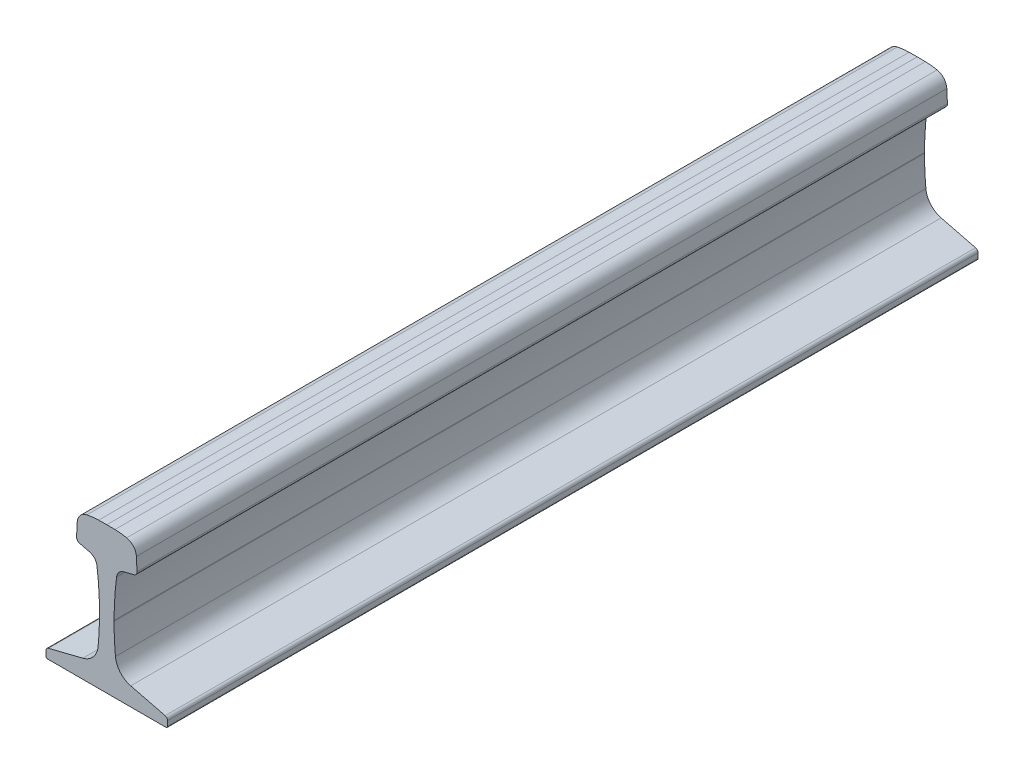
ISO-10303-21;
HEADER;
FILE_DESCRIPTION(('STEP AP214'),'2;1');
FILE_NAME('part.step','',(''),(''),'','','');
FILE_SCHEMA(('AUTOMOTIVE_DESIGN { 1 0 10303 214 1 1 1 1 }'));
ENDSEC;
DATA;
#1=APPLICATION_CONTEXT('core data for automotive mechanical design processes');
#2=APPLICATION_PROTOCOL_DEFINITION('international standard','automotive_design',2000,#1);
#3=PRODUCT_CONTEXT('',#1,'mechanical');
#4=PRODUCT('Part','Part','',(#3));
#5=PRODUCT_RELATED_PRODUCT_CATEGORY('part','',(#4));
#6=PRODUCT_DEFINITION_FORMATION('','',#4);
#7=PRODUCT_DEFINITION_CONTEXT('part definition',#1,'design');
#8=PRODUCT_DEFINITION('design','',#6,#7);
#9=PRODUCT_DEFINITION_SHAPE('','',#8);
#10=(LENGTH_UNIT() NAMED_UNIT(*) SI_UNIT(.MILLI.,.METRE.));
#11=(NAMED_UNIT(*) PLANE_ANGLE_UNIT() SI_UNIT($,.RADIAN.));
#12=(NAMED_UNIT(*) SI_UNIT($,.STERADIAN.) SOLID_ANGLE_UNIT());
#13=UNCERTAINTY_MEASURE_WITH_UNIT(LENGTH_MEASURE(1.E-05),#10,'distance_accuracy_value','');
#14=(GEOMETRIC_REPRESENTATION_CONTEXT(3) GLOBAL_UNCERTAINTY_ASSIGNED_CONTEXT((#13)) GLOBAL_UNIT_ASSIGNED_CONTEXT((#10,
#11,#12)) REPRESENTATION_CONTEXT('',''));
#15=CARTESIAN_POINT('',(0.,0.,0.));
#16=DIRECTION('',(0.,0.,1.));
#17=DIRECTION('',(1.,0.,0.));
#18=AXIS2_PLACEMENT_3D('',#15,#16,#17);
#19=CARTESIAN_POINT('',(9.00000002470919,82.3,-1000.));
#20=DIRECTION('',(1.,0.,0.));
#21=DIRECTION('',(0.,0.,-1.));
#22=AXIS2_PLACEMENT_3D('',#19,#20,#21);
#23=PLANE('',#22);
#24=DIRECTION('',(0.,1.,0.));
#25=VECTOR('',#24,1.);
#26=CARTESIAN_POINT('',(9.00000002470919,82.3,-1000.));
#27=LINE('',#26,#25);
#28=CARTESIAN_POINT('',(9.00000002470805,81.2999999999996,-1000.));
#29=VERTEX_POINT('',#28);
#30=CARTESIAN_POINT('',(9.00000002470921,82.3000000000001,-1000.));
#31=VERTEX_POINT('',#30);
#32=EDGE_CURVE('E332',#29,#31,#27,.T.);
#33=ORIENTED_EDGE('',*,*,#32,.T.);
#34=DIRECTION('',(0.,0.,1.));
#35=VECTOR('',#34,1.);
#36=CARTESIAN_POINT('',(9.00000002470924,82.3000000000001,-1000.));
#37=LINE('',#36,#35);
#38=CARTESIAN_POINT('',(9.00000002470921,82.3000000000001,0.));
#39=VERTEX_POINT('',#38);
#40=EDGE_CURVE('E320',#39,#31,#37,.F.);
#41=ORIENTED_EDGE('',*,*,#40,.F.);
#42=DIRECTION('',(0.,1.,0.));
#43=VECTOR('',#42,1.);
#44=CARTESIAN_POINT('',(9.00000002470919,82.3,0.));
#45=LINE('',#44,#43);
#46=CARTESIAN_POINT('',(9.00000002470805,81.2999999999996,0.));
#47=VERTEX_POINT('',#46);
#48=EDGE_CURVE('E334',#39,#47,#45,.F.);
#49=ORIENTED_EDGE('',*,*,#48,.T.);
#50=DIRECTION('',(0.,0.,1.));
#51=VECTOR('',#50,1.);
#52=CARTESIAN_POINT('',(9.00000002470691,81.2999999999997,-1000.));
#53=LINE('',#52,#51);
#54=EDGE_CURVE('E323',#29,#47,#53,.T.);
#55=ORIENTED_EDGE('',*,*,#54,.F.);
#56=EDGE_LOOP('',(#33,#41,#49,#55));
#57=FACE_BOUND('',#56,.T.);
#58=ADVANCED_FACE('F15',(#57),#23,.T.);
#59=CARTESIAN_POINT('',(-8.99999997529081,82.3,-1000.));
#60=DIRECTION('',(-1.,0.,0.));
#61=DIRECTION('',(0.,0.,1.));
#62=AXIS2_PLACEMENT_3D('',#59,#60,#61);
#63=PLANE('',#62);
#64=DIRECTION('',(0.,1.,0.));
#65=VECTOR('',#64,1.);
#66=CARTESIAN_POINT('',(-8.99999997529081,82.3,-1000.));
#67=LINE('',#66,#65);
#68=CARTESIAN_POINT('',(-8.9999999752908,82.3,-1000.));
#69=VERTEX_POINT('',#68);
#70=CARTESIAN_POINT('',(-8.99999997528966,81.2999999999995,-1000.));
#71=VERTEX_POINT('',#70);
#72=EDGE_CURVE('E229',#69,#71,#67,.F.);
#73=ORIENTED_EDGE('',*,*,#72,.T.);
#74=DIRECTION('',(0.,0.,1.));
#75=VECTOR('',#74,1.);
#76=CARTESIAN_POINT('',(-8.9999999752885,81.2999999999995,-1000.));
#77=LINE('',#76,#75);
#78=CARTESIAN_POINT('',(-8.99999997528966,81.2999999999995,0.));
#79=VERTEX_POINT('',#78);
#80=EDGE_CURVE('E269',#79,#71,#77,.F.);
#81=ORIENTED_EDGE('',*,*,#80,.F.);
#82=DIRECTION('',(0.,1.,0.));
#83=VECTOR('',#82,1.);
#84=CARTESIAN_POINT('',(-8.99999997529081,82.3,0.));
#85=LINE('',#84,#83);
#86=CARTESIAN_POINT('',(-8.9999999752908,82.3,0.));
#87=VERTEX_POINT('',#86);
#88=EDGE_CURVE('E330',#79,#87,#85,.T.);
#89=ORIENTED_EDGE('',*,*,#88,.T.);
#90=DIRECTION('',(0.,0.,1.));
#91=VECTOR('',#90,1.);
#92=CARTESIAN_POINT('',(-8.99999997529077,82.3,-1000.));
#93=LINE('',#92,#91);
#94=EDGE_CURVE('E272',#69,#87,#93,.T.);
#95=ORIENTED_EDGE('',*,*,#94,.F.);
#96=EDGE_LOOP('',(#73,#81,#89,#95));
#97=FACE_BOUND('',#96,.T.);
#98=ADVANCED_FACE('F561',(#97),#63,.T.);
#99=CARTESIAN_POINT('',(71.0000000494184,8.12689437438246,-1000.));
#100=DIRECTION('',(0.,0.,1.));
#101=DIRECTION('',(1.,0.,0.));
#102=AXIS2_PLACEMENT_3D('',#99,#100,#101);
#103=CYLINDRICAL_SURFACE('',#102,4.);
#104=CARTESIAN_POINT('',(71.0000000494184,8.12689437438246,-1000.));
#105=DIRECTION('',(0.,0.,1.));
#106=DIRECTION('',(1.,0.,0.));
#107=AXIS2_PLACEMENT_3D('',#104,#105,#106);
#108=CIRCLE('',#107,4.);
#109=CARTESIAN_POINT('',(75.0000000494184,8.12689437438234,-1000.));
#110=VERTEX_POINT('',#109);
#111=CARTESIAN_POINT('',(71.970142549564,12.0074643749637,-1000.));
#112=VERTEX_POINT('',#111);
#113=EDGE_CURVE('E225',#110,#112,#108,.T.);
#114=ORIENTED_EDGE('',*,*,#113,.T.);
#115=DIRECTION('',(0.,0.,1.));
#116=VECTOR('',#115,1.);
#117=CARTESIAN_POINT('',(71.9701425495642,12.0074643749637,-1000.));
#118=LINE('',#117,#116);
#119=CARTESIAN_POINT('',(71.970142549564,12.0074643749637,0.));
#120=VERTEX_POINT('',#119);
#121=EDGE_CURVE('E219',#120,#112,#118,.F.);
#122=ORIENTED_EDGE('',*,*,#121,.F.);
#123=CARTESIAN_POINT('',(71.0000000494184,8.12689437438246,0.));
#124=DIRECTION('',(0.,0.,1.));
#125=DIRECTION('',(1.,0.,0.));
#126=AXIS2_PLACEMENT_3D('',#123,#124,#125);
#127=CIRCLE('',#126,4.);
#128=CARTESIAN_POINT('',(75.0000000494184,8.12689437438234,0.));
#129=VERTEX_POINT('',#128);
#130=EDGE_CURVE('E18',#129,#120,#127,.T.);
#131=ORIENTED_EDGE('',*,*,#130,.F.);
#132=DIRECTION('',(0.,0.,-1.));
#133=VECTOR('',#132,1.);
#134=CARTESIAN_POINT('',(75.0000000494184,8.12689437438223,-1000.));
#135=LINE('',#134,#133);
#136=EDGE_CURVE('E214',#110,#129,#135,.F.);
#137=ORIENTED_EDGE('',*,*,#136,.F.);
#138=EDGE_LOOP('',(#114,#122,#131,#137));
#139=FACE_BOUND('',#138,.T.);
#140=ADVANCED_FACE('F221',(#139),#103,.T.);
#141=CARTESIAN_POINT('',(71.9701425495642,12.0074643749637,-1000.));
#142=DIRECTION('',(0.242535625036335,0.970142500145331,0.));
#143=DIRECTION('',(-0.970142500145331,0.242535625036335,0.));
#144=AXIS2_PLACEMENT_3D('',#141,#142,#143);
#145=PLANE('',#144);
#146=DIRECTION('',(-0.970142500145331,0.242535625036335,0.));
#147=VECTOR('',#146,1.);
#148=CARTESIAN_POINT('',(71.9701425495642,12.0074643749637,-1000.));
#149=LINE('',#148,#147);
#150=CARTESIAN_POINT('',(29.5201970515815,22.6199507494594,-1000.));
#151=VERTEX_POINT('',#150);
#152=EDGE_CURVE('E385',#112,#151,#149,.T.);
#153=ORIENTED_EDGE('',*,*,#152,.T.);
#154=DIRECTION('',(0.,0.,1.));
#155=VECTOR('',#154,1.);
#156=CARTESIAN_POINT('',(29.5201970515816,22.6199507494594,-1000.));
#157=LINE('',#156,#155);
#158=CARTESIAN_POINT('',(29.5201970515815,22.6199507494594,0.));
#159=VERTEX_POINT('',#158);
#160=EDGE_CURVE('E228',#159,#151,#157,.F.);
#161=ORIENTED_EDGE('',*,*,#160,.F.);
#162=DIRECTION('',(-0.970142500145331,0.242535625036335,0.));
#163=VECTOR('',#162,1.);
#164=CARTESIAN_POINT('',(71.9701425495642,12.0074643749637,0.));
#165=LINE('',#164,#163);
#166=EDGE_CURVE('E232',#120,#159,#165,.T.);
#167=ORIENTED_EDGE('',*,*,#166,.F.);
#168=ORIENTED_EDGE('',*,*,#121,.T.);
#169=EDGE_LOOP('',(#153,#161,#167,#168));
#170=FACE_BOUND('',#169,.T.);
#171=ADVANCED_FACE('F233',(#170),#145,.T.);
#172=CARTESIAN_POINT('',(35.5835876774899,46.8735132530927,-1000.));
#173=DIRECTION('',(0.,0.,1.));
#174=DIRECTION('',(1.,0.,0.));
#175=AXIS2_PLACEMENT_3D('',#172,#173,#174);
#176=CYLINDRICAL_SURFACE('',#175,25.);
#177=CARTESIAN_POINT('',(35.5835876774899,46.8735132530927,-1000.));
#178=DIRECTION('',(0.,0.,1.));
#179=DIRECTION('',(1.,0.,0.));
#180=AXIS2_PLACEMENT_3D('',#177,#178,#179);
#181=CIRCLE('',#180,25.);
#182=CARTESIAN_POINT('',(10.6891601876766,44.578414136634,-1000.));
#183=VERTEX_POINT('',#182);
#184=EDGE_CURVE('E383',#151,#183,#181,.F.);
#185=ORIENTED_EDGE('',*,*,#184,.T.);
#186=DIRECTION('',(0.,0.,1.));
#187=VECTOR('',#186,1.);
#188=CARTESIAN_POINT('',(10.6891601876776,44.5784141366358,-1000.));
#189=LINE('',#188,#187);
#190=CARTESIAN_POINT('',(10.6891601876778,44.5784141366341,0.));
#191=VERTEX_POINT('',#190);
#192=EDGE_CURVE('E324',#191,#183,#189,.F.);
#193=ORIENTED_EDGE('',*,*,#192,.F.);
#194=CARTESIAN_POINT('',(35.5835876774899,46.8735132530927,0.));
#195=DIRECTION('',(0.,0.,1.));
#196=DIRECTION('',(1.,0.,0.));
#197=AXIS2_PLACEMENT_3D('',#194,#195,#196);
#198=CIRCLE('',#197,25.);
#199=EDGE_CURVE('E238',#159,#191,#198,.F.);
#200=ORIENTED_EDGE('',*,*,#199,.F.);
#201=ORIENTED_EDGE('',*,*,#160,.T.);
#202=EDGE_LOOP('',(#185,#193,#200,#201));
#203=FACE_BOUND('',#202,.T.);
#204=ADVANCED_FACE('F443',(#203),#176,.F.);
#205=CARTESIAN_POINT('',(409.000000024709,81.2999999999996,-1000.));
#206=DIRECTION('',(0.,0.,1.));
#207=DIRECTION('',(1.,0.,0.));
#208=AXIS2_PLACEMENT_3D('',#205,#206,#207);
#209=CYLINDRICAL_SURFACE('',#208,400.000000000002);
#210=CARTESIAN_POINT('',(409.000000024709,81.2999999999996,-1000.));
#211=DIRECTION('',(0.,0.,1.));
#212=DIRECTION('',(1.,0.,0.));
#213=AXIS2_PLACEMENT_3D('',#210,#211,#212);
#214=CIRCLE('',#213,400.000000000002);
#215=EDGE_CURVE('E380',#183,#29,#214,.F.);
#216=ORIENTED_EDGE('',*,*,#215,.T.);
#217=ORIENTED_EDGE('',*,*,#54,.T.);
#218=CARTESIAN_POINT('',(409.000000024709,81.2999999999996,0.));
#219=DIRECTION('',(0.,0.,1.));
#220=DIRECTION('',(1.,0.,0.));
#221=AXIS2_PLACEMENT_3D('',#218,#219,#220);
#222=CIRCLE('',#221,400.000000000002);
#223=EDGE_CURVE('E439',#191,#47,#222,.F.);
#224=ORIENTED_EDGE('',*,*,#223,.F.);
#225=ORIENTED_EDGE('',*,*,#192,.T.);
#226=EDGE_LOOP('',(#216,#217,#224,#225));
#227=FACE_BOUND('',#226,.T.);
#228=ADVANCED_FACE('F447',(#227),#209,.F.);
#229=CARTESIAN_POINT('',(379.000000024709,82.3000000000001,-1000.));
#230=DIRECTION('',(0.,0.,1.));
#231=DIRECTION('',(1.,0.,0.));
#232=AXIS2_PLACEMENT_3D('',#229,#230,#231);
#233=CYLINDRICAL_SURFACE('',#232,370.);
#234=CARTESIAN_POINT('',(379.000000024709,82.3000000000001,-1000.));
#235=DIRECTION('',(0.,0.,1.));
#236=DIRECTION('',(1.,0.,0.));
#237=AXIS2_PLACEMENT_3D('',#234,#235,#236);
#238=CIRCLE('',#237,370.);
#239=CARTESIAN_POINT('',(12.1118963680258,130.186526238627,-1000.));
#240=VERTEX_POINT('',#239);
#241=EDGE_CURVE('E378',#31,#240,#238,.F.);
#242=ORIENTED_EDGE('',*,*,#241,.T.);
#243=DIRECTION('',(0.,0.,1.));
#244=VECTOR('',#243,1.);
#245=CARTESIAN_POINT('',(12.1118963680258,130.186526238628,-1000.));
#246=LINE('',#245,#244);
#247=CARTESIAN_POINT('',(12.1118963680258,130.186526238627,0.));
#248=VERTEX_POINT('',#247);
#249=EDGE_CURVE('E317',#248,#240,#246,.F.);
#250=ORIENTED_EDGE('',*,*,#249,.F.);
#251=CARTESIAN_POINT('',(379.000000024709,82.3000000000001,0.));
#252=DIRECTION('',(0.,0.,1.));
#253=DIRECTION('',(1.,0.,0.));
#254=AXIS2_PLACEMENT_3D('',#251,#252,#253);
#255=CIRCLE('',#254,370.);
#256=EDGE_CURVE('E436',#39,#248,#255,.F.);
#257=ORIENTED_EDGE('',*,*,#256,.F.);
#258=ORIENTED_EDGE('',*,*,#40,.T.);
#259=EDGE_LOOP('',(#242,#250,#257,#258));
#260=FACE_BOUND('',#259,.T.);
#261=ADVANCED_FACE('F455',(#260),#233,.F.);
#262=CARTESIAN_POINT('',(24.0109700001345,128.633449711969,-1000.));
#263=DIRECTION('',(0.,0.,1.));
#264=DIRECTION('',(1.,0.,0.));
#265=AXIS2_PLACEMENT_3D('',#262,#263,#264);
#266=CYLINDRICAL_SURFACE('',#265,12.);
#267=CARTESIAN_POINT('',(24.0109700001345,128.633449711969,-1000.));
#268=DIRECTION('',(0.,0.,1.));
#269=DIRECTION('',(1.,0.,0.));
#270=AXIS2_PLACEMENT_3D('',#267,#268,#269);
#271=CIRCLE('',#270,12.);
#272=CARTESIAN_POINT('',(21.1005299878772,140.275156585751,-1000.));
#273=VERTEX_POINT('',#272);
#274=EDGE_CURVE('E376',#240,#273,#271,.F.);
#275=ORIENTED_EDGE('',*,*,#274,.T.);
#276=DIRECTION('',(0.,0.,1.));
#277=VECTOR('',#276,1.);
#278=CARTESIAN_POINT('',(21.1005299878758,140.27515658575,-1000.));
#279=LINE('',#278,#277);
#280=CARTESIAN_POINT('',(21.1005299878772,140.275156585751,1.11022302462516E-13));
#281=VERTEX_POINT('',#280);
#282=EDGE_CURVE('E314',#281,#273,#279,.F.);
#283=ORIENTED_EDGE('',*,*,#282,.F.);
#284=CARTESIAN_POINT('',(24.0109700001345,128.633449711969,0.));
#285=DIRECTION('',(0.,0.,1.));
#286=DIRECTION('',(1.,0.,0.));
#287=AXIS2_PLACEMENT_3D('',#284,#285,#286);
#288=CIRCLE('',#287,12.);
#289=EDGE_CURVE('E433',#248,#281,#288,.F.);
#290=ORIENTED_EDGE('',*,*,#289,.F.);
#291=ORIENTED_EDGE('',*,*,#249,.T.);
#292=EDGE_LOOP('',(#275,#283,#290,#291));
#293=FACE_BOUND('',#292,.T.);
#294=ADVANCED_FACE('F459',(#293),#266,.F.);
#295=CARTESIAN_POINT('',(33.5115059670175,143.377914752788,-1000.));
#296=DIRECTION('',(0.242536667688229,-0.970142239481763,0.));
#297=DIRECTION('',(0.970142239481763,0.242536667688229,0.));
#298=AXIS2_PLACEMENT_3D('',#295,#296,#297);
#299=PLANE('',#298);
#300=DIRECTION('',(0.970142239481824,0.242536667687981,0.));
#301=VECTOR('',#300,1.);
#302=CARTESIAN_POINT('',(21.1005299878758,140.27515658575,-1000.));
#303=LINE('',#302,#301);
#304=CARTESIAN_POINT('',(33.5115059670171,143.377914752784,-1000.));
#305=VERTEX_POINT('',#304);
#306=EDGE_CURVE('E375',#273,#305,#303,.T.);
#307=ORIENTED_EDGE('',*,*,#306,.T.);
#308=DIRECTION('',(0.,0.,1.));
#309=VECTOR('',#308,1.);
#310=CARTESIAN_POINT('',(33.5115059670183,143.377914752784,-1000.));
#311=LINE('',#310,#309);
#312=CARTESIAN_POINT('',(33.5115059670171,143.377914752784,1.11022302462516E-13));
#313=VERTEX_POINT('',#312);
#314=EDGE_CURVE('E311',#313,#305,#311,.F.);
#315=ORIENTED_EDGE('',*,*,#314,.F.);
#316=DIRECTION('',(0.970142239481824,0.242536667687981,0.));
#317=VECTOR('',#316,1.);
#318=CARTESIAN_POINT('',(21.1005299878758,140.27515658575,0.));
#319=LINE('',#318,#317);
#320=EDGE_CURVE('E432',#281,#313,#319,.T.);
#321=ORIENTED_EDGE('',*,*,#320,.F.);
#322=ORIENTED_EDGE('',*,*,#282,.T.);
#323=EDGE_LOOP('',(#307,#315,#321,#322));
#324=FACE_BOUND('',#323,.T.);
#325=ADVANCED_FACE('F463',(#324),#299,.T.);
#326=CARTESIAN_POINT('',(32.2988226285767,148.22862595019,-1000.));
#327=DIRECTION('',(0.,0.,1.));
#328=DIRECTION('',(1.,0.,0.));
#329=AXIS2_PLACEMENT_3D('',#326,#327,#328);
#330=CYLINDRICAL_SURFACE('',#329,4.99999999999672);
#331=CARTESIAN_POINT('',(32.2988226285767,148.22862595019,-1000.));
#332=DIRECTION('',(0.,0.,1.));
#333=DIRECTION('',(1.,0.,0.));
#334=AXIS2_PLACEMENT_3D('',#331,#332,#333);
#335=CIRCLE('',#334,4.99999999999672);
#336=CARTESIAN_POINT('',(37.2925843229658,148.478314034913,-1000.));
#337=VERTEX_POINT('',#336);
#338=EDGE_CURVE('E373',#305,#337,#335,.T.);
#339=ORIENTED_EDGE('',*,*,#338,.T.);
#340=DIRECTION('',(0.,0.,1.));
#341=VECTOR('',#340,1.);
#342=CARTESIAN_POINT('',(37.2925843229656,148.478314034916,-1000.));
#343=LINE('',#342,#341);
#344=CARTESIAN_POINT('',(37.2925843229658,148.478314034913,0.));
#345=VERTEX_POINT('',#344);
#346=EDGE_CURVE('E308',#345,#337,#343,.F.);
#347=ORIENTED_EDGE('',*,*,#346,.F.);
#348=CARTESIAN_POINT('',(32.2988226285767,148.22862595019,0.));
#349=DIRECTION('',(0.,0.,1.));
#350=DIRECTION('',(1.,0.,0.));
#351=AXIS2_PLACEMENT_3D('',#348,#349,#350);
#352=CIRCLE('',#351,4.99999999999672);
#353=EDGE_CURVE('E429',#313,#345,#352,.T.);
#354=ORIENTED_EDGE('',*,*,#353,.F.);
#355=ORIENTED_EDGE('',*,*,#314,.T.);
#356=EDGE_LOOP('',(#339,#347,#354,#355));
#357=FACE_BOUND('',#356,.T.);
#358=ADVANCED_FACE('F509',(#357),#330,.T.);
#359=CARTESIAN_POINT('',(37.2925843229656,148.478314034916,-1000.));
#360=DIRECTION('',(0.998752338877843,0.0499376169439186,0.));
#361=DIRECTION('',(-0.0499376169439186,0.998752338877843,0.));
#362=AXIS2_PLACEMENT_3D('',#359,#360,#361);
#363=PLANE('',#362);
#364=DIRECTION('',(-0.0499376169439173,0.998752338877843,0.));
#365=VECTOR('',#364,1.);
#366=CARTESIAN_POINT('',(37.2925843229656,148.478314034916,-1000.));
#367=LINE('',#366,#365);
#368=CARTESIAN_POINT('',(36.5000000247092,164.330000000036,-1000.));
#369=VERTEX_POINT('',#368);
#370=EDGE_CURVE('E372',#337,#369,#367,.T.);
#371=ORIENTED_EDGE('',*,*,#370,.T.);
#372=DIRECTION('',(0.,0.,1.));
#373=VECTOR('',#372,1.);
#374=CARTESIAN_POINT('',(36.5000000247092,164.330000000036,-1000.));
#375=LINE('',#374,#373);
#376=CARTESIAN_POINT('',(36.5000000247092,164.330000000036,0.));
#377=VERTEX_POINT('',#376);
#378=EDGE_CURVE('E305',#377,#369,#375,.F.);
#379=ORIENTED_EDGE('',*,*,#378,.F.);
#380=DIRECTION('',(-0.0499376169439173,0.998752338877843,0.));
#381=VECTOR('',#380,1.);
#382=CARTESIAN_POINT('',(37.2925843229656,148.478314034916,0.));
#383=LINE('',#382,#381);
#384=EDGE_CURVE('E428',#345,#377,#383,.T.);
#385=ORIENTED_EDGE('',*,*,#384,.F.);
#386=ORIENTED_EDGE('',*,*,#346,.T.);
#387=EDGE_LOOP('',(#371,#379,#385,#386));
#388=FACE_BOUND('',#387,.T.);
#389=ADVANCED_FACE('F513',(#388),#363,.T.);
#390=CARTESIAN_POINT('',(21.5187159719724,163.580915137543,-1000.));
#391=DIRECTION('',(0.,0.,1.));
#392=DIRECTION('',(1.,0.,0.));
#393=AXIS2_PLACEMENT_3D('',#390,#391,#392);
#394=CYLINDRICAL_SURFACE('',#393,15.);
#395=CARTESIAN_POINT('',(21.5187159719724,163.580915137543,-1000.));
#396=DIRECTION('',(0.,0.,1.));
#397=DIRECTION('',(1.,0.,0.));
#398=AXIS2_PLACEMENT_3D('',#395,#396,#397);
#399=CIRCLE('',#398,15.);
#400=CARTESIAN_POINT('',(24.5429500251125,178.272886019349,-1000.));
#401=VERTEX_POINT('',#400);
#402=EDGE_CURVE('E370',#369,#401,#399,.T.);
#403=ORIENTED_EDGE('',*,*,#402,.T.);
#404=DIRECTION('',(0.,0.,1.));
#405=VECTOR('',#404,1.);
#406=CARTESIAN_POINT('',(24.5429500251125,178.272886019349,-1000.));
#407=LINE('',#406,#405);
#408=CARTESIAN_POINT('',(24.5429500251125,178.272886019349,0.));
#409=VERTEX_POINT('',#408);
#410=EDGE_CURVE('E302',#409,#401,#407,.F.);
#411=ORIENTED_EDGE('',*,*,#410,.F.);
#412=CARTESIAN_POINT('',(21.5187159719724,163.580915137543,0.));
#413=DIRECTION('',(0.,0.,1.));
#414=DIRECTION('',(1.,0.,0.));
#415=AXIS2_PLACEMENT_3D('',#412,#413,#414);
#416=CIRCLE('',#415,15.);
#417=EDGE_CURVE('E425',#377,#409,#416,.T.);
#418=ORIENTED_EDGE('',*,*,#417,.F.);
#419=ORIENTED_EDGE('',*,*,#378,.T.);
#420=EDGE_LOOP('',(#403,#411,#418,#419));
#421=FACE_BOUND('',#420,.T.);
#422=ADVANCED_FACE('F516',(#421),#394,.T.);
#423=CARTESIAN_POINT('',(8.41370174169884,99.9157079830519,-1000.));
#424=DIRECTION('',(0.,0.,1.));
#425=DIRECTION('',(1.,0.,0.));
#426=AXIS2_PLACEMENT_3D('',#423,#424,#425);
#427=CYLINDRICAL_SURFACE('',#426,80.);
#428=CARTESIAN_POINT('',(8.41370174169884,99.9157079830519,-1000.));
#429=DIRECTION('',(0.,0.,1.));
#430=DIRECTION('',(1.,0.,0.));
#431=AXIS2_PLACEMENT_3D('',#428,#429,#430);
#432=CIRCLE('',#431,80.);
#433=CARTESIAN_POINT('',(10.0164000250734,179.899652360736,-1000.));
#434=VERTEX_POINT('',#433);
#435=EDGE_CURVE('E368',#401,#434,#432,.T.);
#436=ORIENTED_EDGE('',*,*,#435,.T.);
#437=DIRECTION('',(0.,0.,1.));
#438=VECTOR('',#437,1.);
#439=CARTESIAN_POINT('',(10.0164000250734,179.899652360736,-1000.));
#440=LINE('',#439,#438);
#441=CARTESIAN_POINT('',(10.0164000250734,179.899652360736,0.));
#442=VERTEX_POINT('',#441);
#443=EDGE_CURVE('E299',#442,#434,#440,.F.);
#444=ORIENTED_EDGE('',*,*,#443,.F.);
#445=CARTESIAN_POINT('',(8.41370174169884,99.9157079830519,0.));
#446=DIRECTION('',(0.,0.,1.));
#447=DIRECTION('',(1.,0.,0.));
#448=AXIS2_PLACEMENT_3D('',#445,#446,#447);
#449=CIRCLE('',#448,80.);
#450=EDGE_CURVE('E422',#409,#442,#449,.T.);
#451=ORIENTED_EDGE('',*,*,#450,.F.);
#452=ORIENTED_EDGE('',*,*,#410,.T.);
#453=EDGE_LOOP('',(#436,#444,#451,#452));
#454=FACE_BOUND('',#453,.T.);
#455=ADVANCED_FACE('F520',(#454),#427,.T.);
#456=CARTESIAN_POINT('',(-0.000464246017872497,-319.99999999979,-1000.));
#457=DIRECTION('',(0.,0.,1.));
#458=DIRECTION('',(1.,0.,0.));
#459=AXIS2_PLACEMENT_3D('',#456,#457,#458);
#460=CYLINDRICAL_SURFACE('',#459,500.);
#461=CARTESIAN_POINT('',(-0.000464246017872497,-319.99999999979,-1000.));
#462=DIRECTION('',(0.,0.,1.));
#463=DIRECTION('',(1.,0.,0.));
#464=AXIS2_PLACEMENT_3D('',#461,#462,#463);
#465=CIRCLE('',#464,500.);
#466=CARTESIAN_POINT('',(2.47092192306871E-08,179.999999999995,-1000.));
#467=VERTEX_POINT('',#466);
#468=EDGE_CURVE('E366',#434,#467,#465,.T.);
#469=ORIENTED_EDGE('',*,*,#468,.T.);
#470=DIRECTION('',(0.,0.,1.));
#471=VECTOR('',#470,1.);
#472=CARTESIAN_POINT('',(2.47091946221301E-08,179.999999999995,-1000.));
#473=LINE('',#472,#471);
#474=CARTESIAN_POINT('',(2.47092192306871E-08,179.999999999995,0.));
#475=VERTEX_POINT('',#474);
#476=EDGE_CURVE('E296',#475,#467,#473,.F.);
#477=ORIENTED_EDGE('',*,*,#476,.F.);
#478=CARTESIAN_POINT('',(-0.000464246017872497,-319.99999999979,0.));
#479=DIRECTION('',(0.,0.,1.));
#480=DIRECTION('',(1.,0.,0.));
#481=AXIS2_PLACEMENT_3D('',#478,#479,#480);
#482=CIRCLE('',#481,500.);
#483=EDGE_CURVE('E419',#442,#475,#482,.T.);
#484=ORIENTED_EDGE('',*,*,#483,.F.);
#485=ORIENTED_EDGE('',*,*,#443,.T.);
#486=EDGE_LOOP('',(#469,#477,#484,#485));
#487=FACE_BOUND('',#486,.T.);
#488=ADVANCED_FACE('F524',(#487),#460,.T.);
#489=CARTESIAN_POINT('',(0.000464295436360176,-319.99999999979,-1000.));
#490=DIRECTION('',(0.,0.,1.));
#491=DIRECTION('',(1.,0.,0.));
#492=AXIS2_PLACEMENT_3D('',#489,#490,#491);
#493=CYLINDRICAL_SURFACE('',#492,500.);
#494=CARTESIAN_POINT('',(0.000464295436360176,-319.99999999979,-1000.));
#495=DIRECTION('',(0.,0.,1.));
#496=DIRECTION('',(1.,0.,0.));
#497=AXIS2_PLACEMENT_3D('',#494,#495,#496);
#498=CIRCLE('',#497,500.);
#499=CARTESIAN_POINT('',(-10.0163999756551,179.899652360736,-1000.));
#500=VERTEX_POINT('',#499);
#501=EDGE_CURVE('E364',#467,#500,#498,.T.);
#502=ORIENTED_EDGE('',*,*,#501,.T.);
#503=DIRECTION('',(0.,0.,1.));
#504=VECTOR('',#503,1.);
#505=CARTESIAN_POINT('',(-10.0163999756551,179.899652360736,-1000.));
#506=LINE('',#505,#504);
#507=CARTESIAN_POINT('',(-10.0163999756551,179.899652360736,0.));
#508=VERTEX_POINT('',#507);
#509=EDGE_CURVE('E293',#508,#500,#506,.F.);
#510=ORIENTED_EDGE('',*,*,#509,.F.);
#511=CARTESIAN_POINT('',(0.000464295436360176,-319.99999999979,0.));
#512=DIRECTION('',(0.,0.,1.));
#513=DIRECTION('',(1.,0.,0.));
#514=AXIS2_PLACEMENT_3D('',#511,#512,#513);
#515=CIRCLE('',#514,500.);
#516=EDGE_CURVE('E416',#475,#508,#515,.T.);
#517=ORIENTED_EDGE('',*,*,#516,.F.);
#518=ORIENTED_EDGE('',*,*,#476,.T.);
#519=EDGE_LOOP('',(#502,#510,#517,#518));
#520=FACE_BOUND('',#519,.T.);
#521=ADVANCED_FACE('F528',(#520),#493,.T.);
#522=CARTESIAN_POINT('',(-8.41370169228045,99.9157079830519,-1000.));
#523=DIRECTION('',(0.,0.,1.));
#524=DIRECTION('',(1.,0.,0.));
#525=AXIS2_PLACEMENT_3D('',#522,#523,#524);
#526=CYLINDRICAL_SURFACE('',#525,80.);
#527=CARTESIAN_POINT('',(-8.41370169228045,99.9157079830519,-1000.));
#528=DIRECTION('',(0.,0.,1.));
#529=DIRECTION('',(1.,0.,0.));
#530=AXIS2_PLACEMENT_3D('',#527,#528,#529);
#531=CIRCLE('',#530,80.);
#532=CARTESIAN_POINT('',(-24.5429499756941,178.272886019349,-1000.));
#533=VERTEX_POINT('',#532);
#534=EDGE_CURVE('E362',#500,#533,#531,.T.);
#535=ORIENTED_EDGE('',*,*,#534,.T.);
#536=DIRECTION('',(0.,0.,1.));
#537=VECTOR('',#536,1.);
#538=CARTESIAN_POINT('',(-24.5429499756941,178.272886019349,-1000.));
#539=LINE('',#538,#537);
#540=CARTESIAN_POINT('',(-24.5429499756941,178.272886019349,0.));
#541=VERTEX_POINT('',#540);
#542=EDGE_CURVE('E290',#541,#533,#539,.F.);
#543=ORIENTED_EDGE('',*,*,#542,.F.);
#544=CARTESIAN_POINT('',(-8.41370169228045,99.9157079830519,0.));
#545=DIRECTION('',(0.,0.,1.));
#546=DIRECTION('',(1.,0.,0.));
#547=AXIS2_PLACEMENT_3D('',#544,#545,#546);
#548=CIRCLE('',#547,80.);
#549=EDGE_CURVE('E413',#508,#541,#548,.T.);
#550=ORIENTED_EDGE('',*,*,#549,.F.);
#551=ORIENTED_EDGE('',*,*,#509,.T.);
#552=EDGE_LOOP('',(#535,#543,#550,#551));
#553=FACE_BOUND('',#552,.T.);
#554=ADVANCED_FACE('F532',(#553),#526,.T.);
#555=CARTESIAN_POINT('',(-21.5187159225541,163.580915137543,-1000.));
#556=DIRECTION('',(0.,0.,1.));
#557=DIRECTION('',(1.,0.,0.));
#558=AXIS2_PLACEMENT_3D('',#555,#556,#557);
#559=CYLINDRICAL_SURFACE('',#558,15.);
#560=CARTESIAN_POINT('',(-21.5187159225541,163.580915137543,-1000.));
#561=DIRECTION('',(0.,0.,1.));
#562=DIRECTION('',(1.,0.,0.));
#563=AXIS2_PLACEMENT_3D('',#560,#561,#562);
#564=CIRCLE('',#563,15.);
#565=CARTESIAN_POINT('',(-36.4999999752908,164.330000000036,-1000.));
#566=VERTEX_POINT('',#565);
#567=EDGE_CURVE('E360',#533,#566,#564,.T.);
#568=ORIENTED_EDGE('',*,*,#567,.T.);
#569=DIRECTION('',(0.,0.,1.));
#570=VECTOR('',#569,1.);
#571=CARTESIAN_POINT('',(-36.4999999752908,164.330000000036,-1000.));
#572=LINE('',#571,#570);
#573=CARTESIAN_POINT('',(-36.4999999752908,164.330000000036,0.));
#574=VERTEX_POINT('',#573);
#575=EDGE_CURVE('E287',#574,#566,#572,.F.);
#576=ORIENTED_EDGE('',*,*,#575,.F.);
#577=CARTESIAN_POINT('',(-21.5187159225541,163.580915137543,0.));
#578=DIRECTION('',(0.,0.,1.));
#579=DIRECTION('',(1.,0.,0.));
#580=AXIS2_PLACEMENT_3D('',#577,#578,#579);
#581=CIRCLE('',#580,15.);
#582=EDGE_CURVE('E410',#541,#574,#581,.T.);
#583=ORIENTED_EDGE('',*,*,#582,.F.);
#584=ORIENTED_EDGE('',*,*,#542,.T.);
#585=EDGE_LOOP('',(#568,#576,#583,#584));
#586=FACE_BOUND('',#585,.T.);
#587=ADVANCED_FACE('F536',(#586),#559,.T.);
#588=CARTESIAN_POINT('',(-37.2925842735472,148.478314034916,-1000.));
#589=DIRECTION('',(-0.998752338877843,0.0499376169439177,0.));
#590=DIRECTION('',(-0.0499376169439177,-0.998752338877843,0.));
#591=AXIS2_PLACEMENT_3D('',#588,#589,#590);
#592=PLANE('',#591);
#593=DIRECTION('',(-0.0499376169437131,-0.998752338877854,0.));
#594=VECTOR('',#593,1.);
#595=CARTESIAN_POINT('',(-36.4999999752908,164.330000000036,-1000.));
#596=LINE('',#595,#594);
#597=CARTESIAN_POINT('',(-37.2925842735442,148.478314034912,-1000.));
#598=VERTEX_POINT('',#597);
#599=EDGE_CURVE('E359',#566,#598,#596,.T.);
#600=ORIENTED_EDGE('',*,*,#599,.T.);
#601=DIRECTION('',(0.,0.,1.));
#602=VECTOR('',#601,1.);
#603=CARTESIAN_POINT('',(-37.292584273544,148.478314034916,-1000.));
#604=LINE('',#603,#602);
#605=CARTESIAN_POINT('',(-37.2925842735442,148.478314034912,0.));
#606=VERTEX_POINT('',#605);
#607=EDGE_CURVE('E284',#606,#598,#604,.F.);
#608=ORIENTED_EDGE('',*,*,#607,.F.);
#609=DIRECTION('',(-0.0499376169437131,-0.998752338877854,0.));
#610=VECTOR('',#609,1.);
#611=CARTESIAN_POINT('',(-36.4999999752908,164.330000000036,0.));
#612=LINE('',#611,#610);
#613=EDGE_CURVE('E409',#574,#606,#612,.T.);
#614=ORIENTED_EDGE('',*,*,#613,.F.);
#615=ORIENTED_EDGE('',*,*,#575,.T.);
#616=EDGE_LOOP('',(#600,#608,#614,#615));
#617=FACE_BOUND('',#616,.T.);
#618=ADVANCED_FACE('F540',(#617),#592,.T.);
#619=CARTESIAN_POINT('',(-32.2988225791584,148.22862595019,-1000.));
#620=DIRECTION('',(0.,0.,1.));
#621=DIRECTION('',(1.,0.,0.));
#622=AXIS2_PLACEMENT_3D('',#619,#620,#621);
#623=CYLINDRICAL_SURFACE('',#622,4.99999999999674);
#624=CARTESIAN_POINT('',(-32.2988225791584,148.22862595019,-1000.));
#625=DIRECTION('',(0.,0.,1.));
#626=DIRECTION('',(1.,0.,0.));
#627=AXIS2_PLACEMENT_3D('',#624,#625,#626);
#628=CIRCLE('',#627,4.99999999999674);
#629=CARTESIAN_POINT('',(-33.5115059175985,143.377914752787,-1000.));
#630=VERTEX_POINT('',#629);
#631=EDGE_CURVE('E357',#598,#630,#628,.T.);
#632=ORIENTED_EDGE('',*,*,#631,.T.);
#633=DIRECTION('',(0.,0.,1.));
#634=VECTOR('',#633,1.);
#635=CARTESIAN_POINT('',(-33.5115059175992,143.377914752788,-1000.));
#636=LINE('',#635,#634);
#637=CARTESIAN_POINT('',(-33.5115059175985,143.377914752787,0.));
#638=VERTEX_POINT('',#637);
#639=EDGE_CURVE('E281',#638,#630,#636,.F.);
#640=ORIENTED_EDGE('',*,*,#639,.F.);
#641=CARTESIAN_POINT('',(-32.2988225791584,148.22862595019,0.));
#642=DIRECTION('',(0.,0.,1.));
#643=DIRECTION('',(1.,0.,0.));
#644=AXIS2_PLACEMENT_3D('',#641,#642,#643);
#645=CIRCLE('',#644,4.99999999999674);
#646=EDGE_CURVE('E406',#606,#638,#645,.T.);
#647=ORIENTED_EDGE('',*,*,#646,.F.);
#648=ORIENTED_EDGE('',*,*,#607,.T.);
#649=EDGE_LOOP('',(#632,#640,#647,#648));
#650=FACE_BOUND('',#649,.T.);
#651=ADVANCED_FACE('F544',(#650),#623,.T.);
#652=CARTESIAN_POINT('',(-33.5115059175992,143.377914752788,-1000.));
#653=DIRECTION('',(-0.242536667688227,-0.970142239481763,0.));
#654=DIRECTION('',(0.970142239481763,-0.242536667688227,0.));
#655=AXIS2_PLACEMENT_3D('',#652,#653,#654);
#656=PLANE('',#655);
#657=DIRECTION('',(0.970142239481763,-0.242536667688227,0.));
#658=VECTOR('',#657,1.);
#659=CARTESIAN_POINT('',(-33.5115059175992,143.377914752788,-1000.));
#660=LINE('',#659,#658);
#661=CARTESIAN_POINT('',(-21.1005299384574,140.27515658575,-1000.));
#662=VERTEX_POINT('',#661);
#663=EDGE_CURVE('E356',#630,#662,#660,.T.);
#664=ORIENTED_EDGE('',*,*,#663,.T.);
#665=DIRECTION('',(0.,0.,1.));
#666=VECTOR('',#665,1.);
#667=CARTESIAN_POINT('',(-21.1005299384574,140.27515658575,-1000.));
#668=LINE('',#667,#666);
#669=CARTESIAN_POINT('',(-21.1005299384574,140.27515658575,0.));
#670=VERTEX_POINT('',#669);
#671=EDGE_CURVE('E276',#670,#662,#668,.F.);
#672=ORIENTED_EDGE('',*,*,#671,.F.);
#673=DIRECTION('',(0.970142239481763,-0.242536667688227,0.));
#674=VECTOR('',#673,1.);
#675=CARTESIAN_POINT('',(-33.5115059175992,143.377914752788,0.));
#676=LINE('',#675,#674);
#677=EDGE_CURVE('E405',#638,#670,#676,.T.);
#678=ORIENTED_EDGE('',*,*,#677,.F.);
#679=ORIENTED_EDGE('',*,*,#639,.T.);
#680=EDGE_LOOP('',(#664,#672,#678,#679));
#681=FACE_BOUND('',#680,.T.);
#682=ADVANCED_FACE('F548',(#681),#656,.T.);
#683=CARTESIAN_POINT('',(-24.0109699507161,128.633449711969,-1000.));
#684=DIRECTION('',(0.,0.,1.));
#685=DIRECTION('',(1.,0.,0.));
#686=AXIS2_PLACEMENT_3D('',#683,#684,#685);
#687=CYLINDRICAL_SURFACE('',#686,12.);
#688=CARTESIAN_POINT('',(-24.0109699507161,128.633449711969,-1000.));
#689=DIRECTION('',(0.,0.,1.));
#690=DIRECTION('',(1.,0.,0.));
#691=AXIS2_PLACEMENT_3D('',#688,#689,#690);
#692=CIRCLE('',#691,12.);
#693=CARTESIAN_POINT('',(-12.1118963186074,130.186526238627,-1000.));
#694=VERTEX_POINT('',#693);
#695=EDGE_CURVE('E354',#662,#694,#692,.F.);
#696=ORIENTED_EDGE('',*,*,#695,.T.);
#697=DIRECTION('',(0.,0.,1.));
#698=VECTOR('',#697,1.);
#699=CARTESIAN_POINT('',(-12.1118963186074,130.186526238628,-1000.));
#700=LINE('',#699,#698);
#701=CARTESIAN_POINT('',(-12.1118963186074,130.186526238627,0.));
#702=VERTEX_POINT('',#701);
#703=EDGE_CURVE('E273',#702,#694,#700,.F.);
#704=ORIENTED_EDGE('',*,*,#703,.F.);
#705=CARTESIAN_POINT('',(-24.0109699507161,128.633449711969,0.));
#706=DIRECTION('',(0.,0.,1.));
#707=DIRECTION('',(1.,0.,0.));
#708=AXIS2_PLACEMENT_3D('',#705,#706,#707);
#709=CIRCLE('',#708,12.);
#710=EDGE_CURVE('E402',#670,#702,#709,.F.);
#711=ORIENTED_EDGE('',*,*,#710,.F.);
#712=ORIENTED_EDGE('',*,*,#671,.T.);
#713=EDGE_LOOP('',(#696,#704,#711,#712));
#714=FACE_BOUND('',#713,.T.);
#715=ADVANCED_FACE('F552',(#714),#687,.F.);
#716=CARTESIAN_POINT('',(-378.999999975291,82.3,-1000.));
#717=DIRECTION('',(0.,0.,1.));
#718=DIRECTION('',(1.,0.,0.));
#719=AXIS2_PLACEMENT_3D('',#716,#717,#718);
#720=CYLINDRICAL_SURFACE('',#719,370.);
#721=CARTESIAN_POINT('',(-378.999999975291,82.3,-1000.));
#722=DIRECTION('',(0.,0.,1.));
#723=DIRECTION('',(1.,0.,0.));
#724=AXIS2_PLACEMENT_3D('',#721,#722,#723);
#725=CIRCLE('',#724,370.);
#726=EDGE_CURVE('E351',#694,#69,#725,.F.);
#727=ORIENTED_EDGE('',*,*,#726,.T.);
#728=ORIENTED_EDGE('',*,*,#94,.T.);
#729=CARTESIAN_POINT('',(-378.999999975291,82.3,0.));
#730=DIRECTION('',(0.,0.,1.));
#731=DIRECTION('',(1.,0.,0.));
#732=AXIS2_PLACEMENT_3D('',#729,#730,#731);
#733=CIRCLE('',#732,370.);
#734=EDGE_CURVE('E399',#702,#87,#733,.F.);
#735=ORIENTED_EDGE('',*,*,#734,.F.);
#736=ORIENTED_EDGE('',*,*,#703,.T.);
#737=EDGE_LOOP('',(#727,#728,#735,#736));
#738=FACE_BOUND('',#737,.T.);
#739=ADVANCED_FACE('F556',(#738),#720,.F.);
#740=CARTESIAN_POINT('',(-408.999999975291,81.2999999999995,-1000.));
#741=DIRECTION('',(0.,0.,1.));
#742=DIRECTION('',(1.,0.,0.));
#743=AXIS2_PLACEMENT_3D('',#740,#741,#742);
#744=CYLINDRICAL_SURFACE('',#743,400.000000000002);
#745=CARTESIAN_POINT('',(-408.999999975291,81.2999999999995,-1000.));
#746=DIRECTION('',(0.,0.,1.));
#747=DIRECTION('',(1.,0.,0.));
#748=AXIS2_PLACEMENT_3D('',#745,#746,#747);
#749=CIRCLE('',#748,400.000000000002);
#750=CARTESIAN_POINT('',(-10.6891601382582,44.578414136634,-1000.));
#751=VERTEX_POINT('',#750);
#752=EDGE_CURVE('E349',#71,#751,#749,.F.);
#753=ORIENTED_EDGE('',*,*,#752,.T.);
#754=DIRECTION('',(0.,0.,1.));
#755=VECTOR('',#754,1.);
#756=CARTESIAN_POINT('',(-10.6891601382569,44.5784141366356,-1000.));
#757=LINE('',#756,#755);
#758=CARTESIAN_POINT('',(-10.689160138257,44.5784141366339,0.));
#759=VERTEX_POINT('',#758);
#760=EDGE_CURVE('E266',#759,#751,#757,.F.);
#761=ORIENTED_EDGE('',*,*,#760,.F.);
#762=CARTESIAN_POINT('',(-408.999999975291,81.2999999999995,0.));
#763=DIRECTION('',(0.,0.,1.));
#764=DIRECTION('',(1.,0.,0.));
#765=AXIS2_PLACEMENT_3D('',#762,#763,#764);
#766=CIRCLE('',#765,400.000000000002);
#767=EDGE_CURVE('E396',#79,#759,#766,.F.);
#768=ORIENTED_EDGE('',*,*,#767,.F.);
#769=ORIENTED_EDGE('',*,*,#80,.T.);
#770=EDGE_LOOP('',(#753,#761,#768,#769));
#771=FACE_BOUND('',#770,.T.);
#772=ADVANCED_FACE('F564',(#771),#744,.F.);
#773=CARTESIAN_POINT('',(-35.5835876280715,46.8735132530927,-1000.));
#774=DIRECTION('',(0.,0.,1.));
#775=DIRECTION('',(1.,0.,0.));
#776=AXIS2_PLACEMENT_3D('',#773,#774,#775);
#777=CYLINDRICAL_SURFACE('',#776,25.);
#778=CARTESIAN_POINT('',(-35.5835876280715,46.8735132530927,-1000.));
#779=DIRECTION('',(0.,0.,1.));
#780=DIRECTION('',(1.,0.,0.));
#781=AXIS2_PLACEMENT_3D('',#778,#779,#780);
#782=CIRCLE('',#781,25.);
#783=CARTESIAN_POINT('',(-29.5201970021631,22.6199507494594,-1000.));
#784=VERTEX_POINT('',#783);
#785=EDGE_CURVE('E347',#751,#784,#782,.F.);
#786=ORIENTED_EDGE('',*,*,#785,.T.);
#787=DIRECTION('',(0.,0.,1.));
#788=VECTOR('',#787,1.);
#789=CARTESIAN_POINT('',(-29.5201970021631,22.6199507494594,-1000.));
#790=LINE('',#789,#788);
#791=CARTESIAN_POINT('',(-29.5201970021631,22.6199507494594,0.));
#792=VERTEX_POINT('',#791);
#793=EDGE_CURVE('E263',#792,#784,#790,.F.);
#794=ORIENTED_EDGE('',*,*,#793,.F.);
#795=CARTESIAN_POINT('',(-35.5835876280715,46.8735132530927,0.));
#796=DIRECTION('',(0.,0.,1.));
#797=DIRECTION('',(1.,0.,0.));
#798=AXIS2_PLACEMENT_3D('',#795,#796,#797);
#799=CIRCLE('',#798,25.);
#800=EDGE_CURVE('E393',#759,#792,#799,.F.);
#801=ORIENTED_EDGE('',*,*,#800,.F.);
#802=ORIENTED_EDGE('',*,*,#760,.T.);
#803=EDGE_LOOP('',(#786,#794,#801,#802));
#804=FACE_BOUND('',#803,.T.);
#805=ADVANCED_FACE('F568',(#804),#777,.F.);
#806=CARTESIAN_POINT('',(-71.9701425001458,12.0074643749637,-1000.));
#807=DIRECTION('',(-0.242535625036335,0.970142500145331,0.));
#808=DIRECTION('',(-0.970142500145331,-0.242535625036335,0.));
#809=AXIS2_PLACEMENT_3D('',#806,#807,#808);
#810=PLANE('',#809);
#811=DIRECTION('',(-0.970142500145331,-0.242535625036335,0.));
#812=VECTOR('',#811,1.);
#813=CARTESIAN_POINT('',(-29.5201970021631,22.6199507494594,-1000.));
#814=LINE('',#813,#812);
#815=CARTESIAN_POINT('',(-71.9701425001456,12.0074643749637,-1000.));
#816=VERTEX_POINT('',#815);
#817=EDGE_CURVE('E346',#784,#816,#814,.T.);
#818=ORIENTED_EDGE('',*,*,#817,.T.);
#819=DIRECTION('',(0.,0.,1.));
#820=VECTOR('',#819,1.);
#821=CARTESIAN_POINT('',(-71.9701425001458,12.0074643749637,-1000.));
#822=LINE('',#821,#820);
#823=CARTESIAN_POINT('',(-71.9701425001456,12.0074643749637,0.));
#824=VERTEX_POINT('',#823);
#825=EDGE_CURVE('E260',#824,#816,#822,.F.);
#826=ORIENTED_EDGE('',*,*,#825,.F.);
#827=DIRECTION('',(-0.970142500145331,-0.242535625036335,0.));
#828=VECTOR('',#827,1.);
#829=CARTESIAN_POINT('',(-29.5201970021631,22.6199507494594,0.));
#830=LINE('',#829,#828);
#831=EDGE_CURVE('E392',#792,#824,#830,.T.);
#832=ORIENTED_EDGE('',*,*,#831,.F.);
#833=ORIENTED_EDGE('',*,*,#793,.T.);
#834=EDGE_LOOP('',(#818,#826,#832,#833));
#835=FACE_BOUND('',#834,.T.);
#836=ADVANCED_FACE('F572',(#835),#810,.T.);
#837=CARTESIAN_POINT('',(-71.,8.12689437438246,-1000.));
#838=DIRECTION('',(0.,0.,1.));
#839=DIRECTION('',(1.,0.,0.));
#840=AXIS2_PLACEMENT_3D('',#837,#838,#839);
#841=CYLINDRICAL_SURFACE('',#840,4.);
#842=CARTESIAN_POINT('',(-71.,8.12689437438246,-1000.));
#843=DIRECTION('',(0.,0.,1.));
#844=DIRECTION('',(1.,0.,0.));
#845=AXIS2_PLACEMENT_3D('',#842,#843,#844);
#846=CIRCLE('',#845,4.);
#847=CARTESIAN_POINT('',(-75.,8.12689437438234,-1000.));
#848=VERTEX_POINT('',#847);
#849=EDGE_CURVE('E344',#816,#848,#846,.T.);
#850=ORIENTED_EDGE('',*,*,#849,.T.);
#851=DIRECTION('',(0.,0.,1.));
#852=VECTOR('',#851,1.);
#853=CARTESIAN_POINT('',(-75.,8.12689437438223,-1000.));
#854=LINE('',#853,#852);
#855=CARTESIAN_POINT('',(-75.,8.12689437438234,0.));
#856=VERTEX_POINT('',#855);
#857=EDGE_CURVE('E245',#856,#848,#854,.F.);
#858=ORIENTED_EDGE('',*,*,#857,.F.);
#859=CARTESIAN_POINT('',(-71.,8.12689437438246,0.));
#860=DIRECTION('',(0.,0.,1.));
#861=DIRECTION('',(1.,0.,0.));
#862=AXIS2_PLACEMENT_3D('',#859,#860,#861);
#863=CIRCLE('',#862,4.);
#864=EDGE_CURVE('E390',#824,#856,#863,.T.);
#865=ORIENTED_EDGE('',*,*,#864,.F.);
#866=ORIENTED_EDGE('',*,*,#825,.T.);
#867=EDGE_LOOP('',(#850,#858,#865,#866));
#868=FACE_BOUND('',#867,.T.);
#869=ADVANCED_FACE('F575',(#868),#841,.T.);
#870=CARTESIAN_POINT('',(-75.,2.,-1000.));
#871=DIRECTION('',(-1.,0.,0.));
#872=DIRECTION('',(0.,0.,1.));
#873=AXIS2_PLACEMENT_3D('',#870,#871,#872);
#874=PLANE('',#873);
#875=DIRECTION('',(0.,1.,0.));
#876=VECTOR('',#875,1.);
#877=CARTESIAN_POINT('',(-75.,2.,-1000.));
#878=LINE('',#877,#876);
#879=CARTESIAN_POINT('',(-75.,2.,-1000.));
#880=VERTEX_POINT('',#879);
#881=EDGE_CURVE('E343',#848,#880,#878,.F.);
#882=ORIENTED_EDGE('',*,*,#881,.T.);
#883=DIRECTION('',(0.,0.,1.));
#884=VECTOR('',#883,1.);
#885=CARTESIAN_POINT('',(-75.,2.,-1000.));
#886=LINE('',#885,#884);
#887=CARTESIAN_POINT('',(-75.,2.,0.));
#888=VERTEX_POINT('',#887);
#889=EDGE_CURVE('E253',#888,#880,#886,.F.);
#890=ORIENTED_EDGE('',*,*,#889,.F.);
#891=DIRECTION('',(0.,1.,0.));
#892=VECTOR('',#891,1.);
#893=CARTESIAN_POINT('',(-75.,2.,0.));
#894=LINE('',#893,#892);
#895=EDGE_CURVE('E389',#856,#888,#894,.F.);
#896=ORIENTED_EDGE('',*,*,#895,.F.);
#897=ORIENTED_EDGE('',*,*,#857,.T.);
#898=EDGE_LOOP('',(#882,#890,#896,#897));
#899=FACE_BOUND('',#898,.T.);
#900=ADVANCED_FACE('F492',(#899),#874,.T.);
#901=CARTESIAN_POINT('',(75.0000000494184,2.,-1000.));
#902=DIRECTION('',(1.,0.,0.));
#903=DIRECTION('',(0.,0.,-1.));
#904=AXIS2_PLACEMENT_3D('',#901,#902,#903);
#905=PLANE('',#904);
#906=DIRECTION('',(0.,1.,0.));
#907=VECTOR('',#906,1.);
#908=CARTESIAN_POINT('',(75.0000000494184,2.,-1000.));
#909=LINE('',#908,#907);
#910=CARTESIAN_POINT('',(75.0000000494184,2.,-1000.));
#911=VERTEX_POINT('',#910);
#912=EDGE_CURVE('E256',#911,#110,#909,.T.);
#913=ORIENTED_EDGE('',*,*,#912,.T.);
#914=ORIENTED_EDGE('',*,*,#136,.T.);
#915=DIRECTION('',(0.,1.,0.));
#916=VECTOR('',#915,1.);
#917=CARTESIAN_POINT('',(75.0000000494184,2.,0.));
#918=LINE('',#917,#916);
#919=CARTESIAN_POINT('',(75.0000000494184,2.,0.));
#920=VERTEX_POINT('',#919);
#921=EDGE_CURVE('E243',#920,#129,#918,.T.);
#922=ORIENTED_EDGE('',*,*,#921,.F.);
#923=DIRECTION('',(0.,0.,1.));
#924=VECTOR('',#923,1.);
#925=CARTESIAN_POINT('',(75.0000000494184,2.,-1000.));
#926=LINE('',#925,#924);
#927=EDGE_CURVE('E249',#911,#920,#926,.T.);
#928=ORIENTED_EDGE('',*,*,#927,.F.);
#929=EDGE_LOOP('',(#913,#914,#922,#928));
#930=FACE_BOUND('',#929,.T.);
#931=ADVANCED_FACE('F505',(#930),#905,.T.);
#932=CARTESIAN_POINT('',(-73.,2.,0.));
#933=DIRECTION('',(0.,0.,1.));
#934=DIRECTION('',(1.,0.,0.));
#935=AXIS2_PLACEMENT_3D('',#932,#933,#934);
#936=PLANE('',#935);
#937=ORIENTED_EDGE('',*,*,#864,.T.);
#938=ORIENTED_EDGE('',*,*,#895,.T.);
#939=CARTESIAN_POINT('',(-73.,2.,0.));
#940=DIRECTION('',(0.,0.,1.));
#941=DIRECTION('',(1.,0.,0.));
#942=AXIS2_PLACEMENT_3D('',#939,#940,#941);
#943=CIRCLE('',#942,2.);
#944=CARTESIAN_POINT('',(-73.,0.,0.));
#945=VERTEX_POINT('',#944);
#946=EDGE_CURVE('E257',#945,#888,#943,.F.);
#947=ORIENTED_EDGE('',*,*,#946,.F.);
#948=DIRECTION('',(1.,0.,0.));
#949=VECTOR('',#948,1.);
#950=CARTESIAN_POINT('',(2.47092046505402E-08,0.,0.));
#951=LINE('',#950,#949);
#952=CARTESIAN_POINT('',(73.0000000494184,0.,0.));
#953=VERTEX_POINT('',#952);
#954=EDGE_CURVE('E252',#953,#945,#951,.F.);
#955=ORIENTED_EDGE('',*,*,#954,.F.);
#956=CARTESIAN_POINT('',(73.0000000494184,2.,0.));
#957=DIRECTION('',(0.,0.,1.));
#958=DIRECTION('',(1.,0.,0.));
#959=AXIS2_PLACEMENT_3D('',#956,#957,#958);
#960=CIRCLE('',#959,2.);
#961=EDGE_CURVE('E338',#920,#953,#960,.F.);
#962=ORIENTED_EDGE('',*,*,#961,.F.);
#963=ORIENTED_EDGE('',*,*,#921,.T.);
#964=ORIENTED_EDGE('',*,*,#130,.T.);
#965=ORIENTED_EDGE('',*,*,#166,.T.);
#966=ORIENTED_EDGE('',*,*,#199,.T.);
#967=ORIENTED_EDGE('',*,*,#223,.T.);
#968=ORIENTED_EDGE('',*,*,#48,.F.);
#969=ORIENTED_EDGE('',*,*,#256,.T.);
#970=ORIENTED_EDGE('',*,*,#289,.T.);
#971=ORIENTED_EDGE('',*,*,#320,.T.);
#972=ORIENTED_EDGE('',*,*,#353,.T.);
#973=ORIENTED_EDGE('',*,*,#384,.T.);
#974=ORIENTED_EDGE('',*,*,#417,.T.);
#975=ORIENTED_EDGE('',*,*,#450,.T.);
#976=ORIENTED_EDGE('',*,*,#483,.T.);
#977=ORIENTED_EDGE('',*,*,#516,.T.);
#978=ORIENTED_EDGE('',*,*,#549,.T.);
#979=ORIENTED_EDGE('',*,*,#582,.T.);
#980=ORIENTED_EDGE('',*,*,#613,.T.);
#981=ORIENTED_EDGE('',*,*,#646,.T.);
#982=ORIENTED_EDGE('',*,*,#677,.T.);
#983=ORIENTED_EDGE('',*,*,#710,.T.);
#984=ORIENTED_EDGE('',*,*,#734,.T.);
#985=ORIENTED_EDGE('',*,*,#88,.F.);
#986=ORIENTED_EDGE('',*,*,#767,.T.);
#987=ORIENTED_EDGE('',*,*,#800,.T.);
#988=ORIENTED_EDGE('',*,*,#831,.T.);
#989=EDGE_LOOP('',(#937,#938,#947,#955,#962,#963,#964,#965,#966,#967,#968,#969,#970,#971,#972,
#973,#974,#975,#976,#977,#978,#979,#980,#981,#982,#983,#984,#985,#986,#987,#988));
#990=FACE_BOUND('',#989,.T.);
#991=ADVANCED_FACE('F241',(#990),#936,.T.);
#992=CARTESIAN_POINT('',(-73.,2.,-1000.));
#993=DIRECTION('',(0.,0.,1.));
#994=DIRECTION('',(1.,0.,0.));
#995=AXIS2_PLACEMENT_3D('',#992,#993,#994);
#996=CYLINDRICAL_SURFACE('',#995,2.);
#997=CARTESIAN_POINT('',(-73.,2.,-1000.));
#998=DIRECTION('',(0.,0.,1.));
#999=DIRECTION('',(1.,0.,0.));
#1000=AXIS2_PLACEMENT_3D('',#997,#998,#999);
#1001=CIRCLE('',#1000,2.);
#1002=CARTESIAN_POINT('',(-73.,0.,-1000.));
#1003=VERTEX_POINT('',#1002);
#1004=EDGE_CURVE('E341',#880,#1003,#1001,.T.);
#1005=ORIENTED_EDGE('',*,*,#1004,.T.);
#1006=DIRECTION('',(0.,0.,1.));
#1007=VECTOR('',#1006,1.);
#1008=CARTESIAN_POINT('',(-73.,0.,-1000.));
#1009=LINE('',#1008,#1007);
#1010=EDGE_CURVE('E476',#945,#1003,#1009,.F.);
#1011=ORIENTED_EDGE('',*,*,#1010,.F.);
#1012=ORIENTED_EDGE('',*,*,#946,.T.);
#1013=ORIENTED_EDGE('',*,*,#889,.T.);
#1014=EDGE_LOOP('',(#1005,#1011,#1012,#1013));
#1015=FACE_BOUND('',#1014,.T.);
#1016=ADVANCED_FACE('F497',(#1015),#996,.T.);
#1017=CARTESIAN_POINT('',(-73.,2.,-1000.));
#1018=DIRECTION('',(0.,0.,1.));
#1019=DIRECTION('',(1.,0.,0.));
#1020=AXIS2_PLACEMENT_3D('',#1017,#1018,#1019);
#1021=PLANE('',#1020);
#1022=ORIENTED_EDGE('',*,*,#881,.F.);
#1023=ORIENTED_EDGE('',*,*,#849,.F.);
#1024=ORIENTED_EDGE('',*,*,#817,.F.);
#1025=ORIENTED_EDGE('',*,*,#785,.F.);
#1026=ORIENTED_EDGE('',*,*,#752,.F.);
#1027=ORIENTED_EDGE('',*,*,#72,.F.);
#1028=ORIENTED_EDGE('',*,*,#726,.F.);
#1029=ORIENTED_EDGE('',*,*,#695,.F.);
#1030=ORIENTED_EDGE('',*,*,#663,.F.);
#1031=ORIENTED_EDGE('',*,*,#631,.F.);
#1032=ORIENTED_EDGE('',*,*,#599,.F.);
#1033=ORIENTED_EDGE('',*,*,#567,.F.);
#1034=ORIENTED_EDGE('',*,*,#534,.F.);
#1035=ORIENTED_EDGE('',*,*,#501,.F.);
#1036=ORIENTED_EDGE('',*,*,#468,.F.);
#1037=ORIENTED_EDGE('',*,*,#435,.F.);
#1038=ORIENTED_EDGE('',*,*,#402,.F.);
#1039=ORIENTED_EDGE('',*,*,#370,.F.);
#1040=ORIENTED_EDGE('',*,*,#338,.F.);
#1041=ORIENTED_EDGE('',*,*,#306,.F.);
#1042=ORIENTED_EDGE('',*,*,#274,.F.);
#1043=ORIENTED_EDGE('',*,*,#241,.F.);
#1044=ORIENTED_EDGE('',*,*,#32,.F.);
#1045=ORIENTED_EDGE('',*,*,#215,.F.);
#1046=ORIENTED_EDGE('',*,*,#184,.F.);
#1047=ORIENTED_EDGE('',*,*,#152,.F.);
#1048=ORIENTED_EDGE('',*,*,#113,.F.);
#1049=ORIENTED_EDGE('',*,*,#912,.F.);
#1050=CARTESIAN_POINT('',(73.0000000494184,2.,-1000.));
#1051=DIRECTION('',(0.,0.,1.));
#1052=DIRECTION('',(1.,0.,0.));
#1053=AXIS2_PLACEMENT_3D('',#1050,#1051,#1052);
#1054=CIRCLE('',#1053,2.);
#1055=CARTESIAN_POINT('',(73.0000000494184,0.,-1000.));
#1056=VERTEX_POINT('',#1055);
#1057=EDGE_CURVE('E33',#1056,#911,#1054,.T.);
#1058=ORIENTED_EDGE('',*,*,#1057,.F.);
#1059=DIRECTION('',(1.,0.,0.));
#1060=VECTOR('',#1059,1.);
#1061=CARTESIAN_POINT('',(2.47092046505402E-08,0.,-1000.));
#1062=LINE('',#1061,#1060);
#1063=EDGE_CURVE('E24',#1003,#1056,#1062,.T.);
#1064=ORIENTED_EDGE('',*,*,#1063,.F.);
#1065=ORIENTED_EDGE('',*,*,#1004,.F.);
#1066=EDGE_LOOP('',(#1022,#1023,#1024,#1025,#1026,#1027,#1028,#1029,#1030,#1031,#1032,#1033,
#1034,#1035,#1036,#1037,#1038,#1039,#1040,#1041,#1042,#1043,#1044,#1045,#1046,#1047,#1048,#1049,
#1058,#1064,#1065));
#1067=FACE_BOUND('',#1066,.T.);
#1068=ADVANCED_FACE('F499',(#1067),#1021,.F.);
#1069=CARTESIAN_POINT('',(73.0000000494184,2.,-1000.));
#1070=DIRECTION('',(0.,0.,1.));
#1071=DIRECTION('',(1.,0.,0.));
#1072=AXIS2_PLACEMENT_3D('',#1069,#1070,#1071);
#1073=CYLINDRICAL_SURFACE('',#1072,2.);
#1074=ORIENTED_EDGE('',*,*,#1057,.T.);
#1075=ORIENTED_EDGE('',*,*,#927,.T.);
#1076=ORIENTED_EDGE('',*,*,#961,.T.);
#1077=DIRECTION('',(0.,0.,1.));
#1078=VECTOR('',#1077,1.);
#1079=CARTESIAN_POINT('',(73.0000000494184,0.,-1000.));
#1080=LINE('',#1079,#1078);
#1081=EDGE_CURVE('E9',#1056,#953,#1080,.T.);
#1082=ORIENTED_EDGE('',*,*,#1081,.F.);
#1083=EDGE_LOOP('',(#1074,#1075,#1076,#1082));
#1084=FACE_BOUND('',#1083,.T.);
#1085=ADVANCED_FACE('F503',(#1084),#1073,.T.);
#1086=CARTESIAN_POINT('',(2.47092046505402E-08,0.,-1000.));
#1087=DIRECTION('',(0.,-1.,0.));
#1088=DIRECTION('',(1.,0.,0.));
#1089=AXIS2_PLACEMENT_3D('',#1086,#1087,#1088);
#1090=PLANE('',#1089);
#1091=ORIENTED_EDGE('',*,*,#1063,.T.);
#1092=ORIENTED_EDGE('',*,*,#1081,.T.);
#1093=ORIENTED_EDGE('',*,*,#954,.T.);
#1094=ORIENTED_EDGE('',*,*,#1010,.T.);
#1095=EDGE_LOOP('',(#1091,#1092,#1093,#1094));
#1096=FACE_BOUND('',#1095,.T.);
#1097=ADVANCED_FACE('F501',(#1096),#1090,.T.);
#1098=CLOSED_SHELL('',(#58,#98,#140,#171,#204,#228,#261,#294,#325,#358,#389,#422,#455,#488,#521,
#554,#587,#618,#651,#682,#715,#739,#772,#805,#836,#869,#900,#931,#991,#1016,#1068,#1085,#1097));
#1099=MANIFOLD_SOLID_BREP('B1',#1098);
#1100=ADVANCED_BREP_SHAPE_REPRESENTATION('',(#18,#1099),#14);
#1101=SHAPE_DEFINITION_REPRESENTATION(#9,#1100);
ENDSEC;
END-ISO-10303-21;
